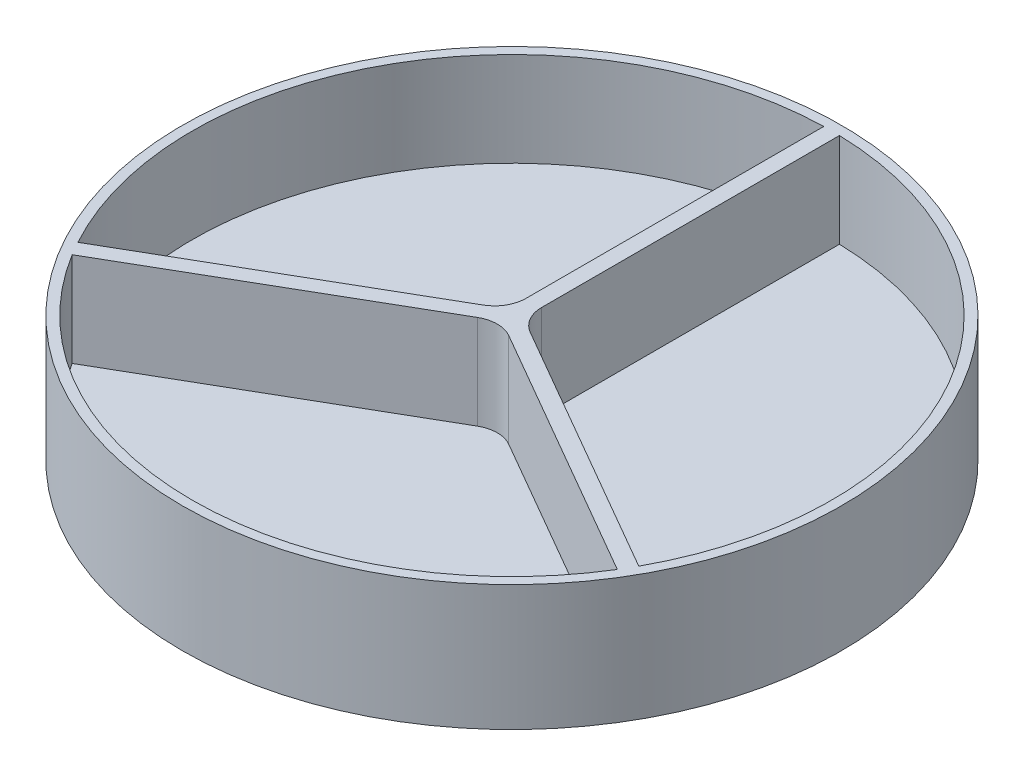
ISO-10303-21;
HEADER;
FILE_DESCRIPTION(('STEP AP214'),'2;1');
FILE_NAME('part.step','',(''),(''),'','','');
FILE_SCHEMA(('AUTOMOTIVE_DESIGN { 1 0 10303 214 1 1 1 1 }'));
ENDSEC;
DATA;
#1=APPLICATION_CONTEXT('core data for automotive mechanical design processes');
#2=APPLICATION_PROTOCOL_DEFINITION('international standard','automotive_design',2000,#1);
#3=PRODUCT_CONTEXT('',#1,'mechanical');
#4=PRODUCT('Part','Part','',(#3));
#5=PRODUCT_RELATED_PRODUCT_CATEGORY('part','',(#4));
#6=PRODUCT_DEFINITION_FORMATION('','',#4);
#7=PRODUCT_DEFINITION_CONTEXT('part definition',#1,'design');
#8=PRODUCT_DEFINITION('design','',#6,#7);
#9=PRODUCT_DEFINITION_SHAPE('','',#8);
#10=(LENGTH_UNIT() NAMED_UNIT(*) SI_UNIT(.MILLI.,.METRE.));
#11=(NAMED_UNIT(*) PLANE_ANGLE_UNIT() SI_UNIT($,.RADIAN.));
#12=(NAMED_UNIT(*) SI_UNIT($,.STERADIAN.) SOLID_ANGLE_UNIT());
#13=UNCERTAINTY_MEASURE_WITH_UNIT(LENGTH_MEASURE(1.E-05),#10,'distance_accuracy_value','');
#14=(GEOMETRIC_REPRESENTATION_CONTEXT(3) GLOBAL_UNCERTAINTY_ASSIGNED_CONTEXT((#13)) GLOBAL_UNIT_ASSIGNED_CONTEXT((#10,
#11,#12)) REPRESENTATION_CONTEXT('',''));
#15=CARTESIAN_POINT('',(0.,0.,0.));
#16=DIRECTION('',(0.,0.,1.));
#17=DIRECTION('',(1.,0.,0.));
#18=AXIS2_PLACEMENT_3D('',#15,#16,#17);
#19=CARTESIAN_POINT('',(0.,8.,0.));
#20=DIRECTION('',(0.,1.,0.));
#21=DIRECTION('',(0.,0.,1.));
#22=AXIS2_PLACEMENT_3D('',#19,#20,#21);
#23=PLANE('',#22);
#24=DIRECTION('',(0.866025403784439,0.,-0.5));
#25=VECTOR('',#24,1.);
#26=CARTESIAN_POINT('',(-0.916040457454182,8.,-1.58662861409928));
#27=LINE('',#26,#25);
#28=CARTESIAN_POINT('',(-71.4792752872217,8.,39.1530740097578));
#29=VERTEX_POINT('',#28);
#30=CARTESIAN_POINT('',(-6.,8.,1.34859679633871));
#31=VERTEX_POINT('',#30);
#32=EDGE_CURVE('E247',#29,#31,#27,.T.);
#33=ORIENTED_EDGE('',*,*,#32,.T.);
#34=CARTESIAN_POINT('',(-9.99999999999999,8.,-5.5796064339368));
#35=DIRECTION('',(0.,1.,0.));
#36=DIRECTION('',(0.,0.,1.));
#37=AXIS2_PLACEMENT_3D('',#34,#35,#36);
#38=CIRCLE('',#37,7.99999999999999);
#39=CARTESIAN_POINT('',(-2.,8.,-5.5796064339368));
#40=VERTEX_POINT('',#39);
#41=EDGE_CURVE('E270',#31,#40,#38,.T.);
#42=ORIENTED_EDGE('',*,*,#41,.T.);
#43=DIRECTION('',(0.,0.,1.));
#44=VECTOR('',#43,1.);
#45=CARTESIAN_POINT('',(-2.,8.,0.));
#46=LINE('',#45,#44);
#47=CARTESIAN_POINT('',(-2.,8.,-81.4754564270738));
#48=VERTEX_POINT('',#47);
#49=EDGE_CURVE('E91',#48,#40,#46,.T.);
#50=ORIENTED_EDGE('',*,*,#49,.F.);
#51=CARTESIAN_POINT('',(0.,8.,0.));
#52=DIRECTION('',(0.,1.,0.));
#53=DIRECTION('',(0.,0.,1.));
#54=AXIS2_PLACEMENT_3D('',#51,#52,#53);
#55=CIRCLE('',#54,81.5);
#56=EDGE_CURVE('E12',#48,#29,#55,.T.);
#57=ORIENTED_EDGE('',*,*,#56,.T.);
#58=EDGE_LOOP('',(#33,#42,#50,#57));
#59=FACE_BOUND('',#58,.T.);
#60=ADVANCED_FACE('F83',(#59),#23,.T.);
#61=CARTESIAN_POINT('',(1.08395954254582,32.,1.87747300103847));
#62=DIRECTION('',(-0.5,0.,-0.866025403784439));
#63=DIRECTION('',(-0.866025403784439,0.,0.5));
#64=AXIS2_PLACEMENT_3D('',#61,#62,#63);
#65=PLANE('',#64);
#66=DIRECTION('',(0.,-1.,0.));
#67=VECTOR('',#66,1.);
#68=CARTESIAN_POINT('',(-69.472135836453,32.,42.6130536610723));
#69=LINE('',#68,#67);
#70=CARTESIAN_POINT('',(-69.472135836453,32.,42.6130536610723));
#71=VERTEX_POINT('',#70);
#72=CARTESIAN_POINT('',(-69.472135836453,8.,42.6130536610723));
#73=VERTEX_POINT('',#72);
#74=EDGE_CURVE('E185',#71,#73,#69,.T.);
#75=ORIENTED_EDGE('',*,*,#74,.T.);
#76=DIRECTION('',(0.866025403784439,0.,-0.5));
#77=VECTOR('',#76,1.);
#78=CARTESIAN_POINT('',(1.08395954254582,8.,1.87747300103847));
#79=LINE('',#78,#77);
#80=CARTESIAN_POINT('',(-3.99999999999906,8.,4.81269841147592));
#81=VERTEX_POINT('',#80);
#82=EDGE_CURVE('E98',#73,#81,#79,.T.);
#83=ORIENTED_EDGE('',*,*,#82,.T.);
#84=DIRECTION('',(0.,-1.,0.));
#85=VECTOR('',#84,1.);
#86=CARTESIAN_POINT('',(-3.99999999999906,32.,4.81269841147592));
#87=LINE('',#86,#85);
#88=CARTESIAN_POINT('',(-3.99999999999906,32.,4.81269841147592));
#89=VERTEX_POINT('',#88);
#90=EDGE_CURVE('E245',#89,#81,#87,.T.);
#91=ORIENTED_EDGE('',*,*,#90,.F.);
#92=DIRECTION('',(0.866025403784439,0.,-0.5));
#93=VECTOR('',#92,1.);
#94=CARTESIAN_POINT('',(1.08395954254582,32.,1.87747300103847));
#95=LINE('',#94,#93);
#96=EDGE_CURVE('E229',#71,#89,#95,.T.);
#97=ORIENTED_EDGE('',*,*,#96,.F.);
#98=EDGE_LOOP('',(#75,#83,#91,#97));
#99=FACE_BOUND('',#98,.T.);
#100=ADVANCED_FACE('F316',(#99),#65,.F.);
#101=CARTESIAN_POINT('',(9.36750677027476E-13,32.,11.7409016417514));
#102=DIRECTION('',(0.,-1.,0.));
#103=DIRECTION('',(0.,0.,-1.));
#104=AXIS2_PLACEMENT_3D('',#101,#102,#103);
#105=CYLINDRICAL_SURFACE('',#104,7.99999999999999);
#106=ORIENTED_EDGE('',*,*,#90,.T.);
#107=CARTESIAN_POINT('',(9.36750677027476E-13,8.,11.7409016417514));
#108=DIRECTION('',(0.,1.,0.));
#109=DIRECTION('',(0.,0.,1.));
#110=AXIS2_PLACEMENT_3D('',#107,#108,#109);
#111=CIRCLE('',#110,7.99999999999999);
#112=CARTESIAN_POINT('',(4.00000000000093,8.,4.81269841147593));
#113=VERTEX_POINT('',#112);
#114=EDGE_CURVE('E105',#81,#113,#111,.F.);
#115=ORIENTED_EDGE('',*,*,#114,.T.);
#116=DIRECTION('',(0.,-1.,0.));
#117=VECTOR('',#116,1.);
#118=CARTESIAN_POINT('',(4.00000000000093,32.,4.81269841147593));
#119=LINE('',#118,#117);
#120=CARTESIAN_POINT('',(4.00000000000093,32.,4.81269841147593));
#121=VERTEX_POINT('',#120);
#122=EDGE_CURVE('E184',#121,#113,#119,.T.);
#123=ORIENTED_EDGE('',*,*,#122,.F.);
#124=CARTESIAN_POINT('',(9.36750677027476E-13,32.,11.7409016417514));
#125=DIRECTION('',(0.,1.,0.));
#126=DIRECTION('',(0.,0.,1.));
#127=AXIS2_PLACEMENT_3D('',#124,#125,#126);
#128=CIRCLE('',#127,7.99999999999999);
#129=EDGE_CURVE('E232',#89,#121,#128,.F.);
#130=ORIENTED_EDGE('',*,*,#129,.F.);
#131=EDGE_LOOP('',(#106,#115,#123,#130));
#132=FACE_BOUND('',#131,.T.);
#133=ADVANCED_FACE('F320',(#132),#105,.F.);
#134=CARTESIAN_POINT('',(-1.08395954254535,32.,1.87747300103767));
#135=DIRECTION('',(-0.5,0.,0.866025403784439));
#136=DIRECTION('',(0.866025403784439,0.,0.5));
#137=AXIS2_PLACEMENT_3D('',#134,#135,#136);
#138=PLANE('',#137);
#139=DIRECTION('',(-0.866025403784439,0.,-0.5));
#140=VECTOR('',#139,1.);
#141=CARTESIAN_POINT('',(-1.08395954254535,8.,1.87747300103767));
#142=LINE('',#141,#140);
#143=CARTESIAN_POINT('',(69.4721358364535,8.,42.6130536610715));
#144=VERTEX_POINT('',#143);
#145=EDGE_CURVE('E188',#144,#113,#142,.T.);
#146=ORIENTED_EDGE('',*,*,#145,.F.);
#147=DIRECTION('',(0.,-1.,0.));
#148=VECTOR('',#147,1.);
#149=CARTESIAN_POINT('',(69.4721358364535,32.,42.6130536610715));
#150=LINE('',#149,#148);
#151=CARTESIAN_POINT('',(69.4721358364535,32.,42.6130536610715));
#152=VERTEX_POINT('',#151);
#153=EDGE_CURVE('E174',#152,#144,#150,.T.);
#154=ORIENTED_EDGE('',*,*,#153,.F.);
#155=DIRECTION('',(-0.866025403784439,0.,-0.5));
#156=VECTOR('',#155,1.);
#157=CARTESIAN_POINT('',(-1.08395954254535,32.,1.87747300103767));
#158=LINE('',#157,#156);
#159=EDGE_CURVE('E234',#152,#121,#158,.T.);
#160=ORIENTED_EDGE('',*,*,#159,.T.);
#161=ORIENTED_EDGE('',*,*,#122,.T.);
#162=EDGE_LOOP('',(#146,#154,#160,#161));
#163=FACE_BOUND('',#162,.T.);
#164=ADVANCED_FACE('F189',(#163),#138,.T.);
#165=CARTESIAN_POINT('',(0.,32.,0.));
#166=DIRECTION('',(0.,-1.,0.));
#167=DIRECTION('',(0.,0.,-1.));
#168=AXIS2_PLACEMENT_3D('',#165,#166,#167);
#169=CYLINDRICAL_SURFACE('',#168,81.5);
#170=DIRECTION('',(0.,-1.,0.));
#171=VECTOR('',#170,1.);
#172=CARTESIAN_POINT('',(-71.4792752872217,32.,39.1530740097578));
#173=LINE('',#172,#171);
#174=CARTESIAN_POINT('',(-71.4792752872217,32.,39.1530740097578));
#175=VERTEX_POINT('',#174);
#176=EDGE_CURVE('E248',#175,#29,#173,.T.);
#177=ORIENTED_EDGE('',*,*,#176,.T.);
#178=ORIENTED_EDGE('',*,*,#56,.F.);
#179=DIRECTION('',(0.,-1.,0.));
#180=VECTOR('',#179,1.);
#181=CARTESIAN_POINT('',(-2.,32.,-81.4754564270738));
#182=LINE('',#181,#180);
#183=CARTESIAN_POINT('',(-2.,32.,-81.4754564270738));
#184=VERTEX_POINT('',#183);
#185=EDGE_CURVE('E242',#184,#48,#182,.T.);
#186=ORIENTED_EDGE('',*,*,#185,.F.);
#187=CARTESIAN_POINT('',(0.,32.,0.));
#188=DIRECTION('',(0.,1.,0.));
#189=DIRECTION('',(0.,0.,1.));
#190=AXIS2_PLACEMENT_3D('',#187,#188,#189);
#191=CIRCLE('',#190,81.5);
#192=EDGE_CURVE('E213',#184,#175,#191,.T.);
#193=ORIENTED_EDGE('',*,*,#192,.T.);
#194=EDGE_LOOP('',(#177,#178,#186,#193));
#195=FACE_BOUND('',#194,.T.);
#196=ADVANCED_FACE('F286',(#195),#169,.F.);
#197=CARTESIAN_POINT('',(-2.,32.,0.));
#198=DIRECTION('',(1.,0.,0.));
#199=DIRECTION('',(0.,0.,-1.));
#200=AXIS2_PLACEMENT_3D('',#197,#198,#199);
#201=PLANE('',#200);
#202=ORIENTED_EDGE('',*,*,#49,.T.);
#203=DIRECTION('',(0.,-1.,0.));
#204=VECTOR('',#203,1.);
#205=CARTESIAN_POINT('',(-2.,32.,-5.5796064339368));
#206=LINE('',#205,#204);
#207=CARTESIAN_POINT('',(-2.,32.,-5.5796064339368));
#208=VERTEX_POINT('',#207);
#209=EDGE_CURVE('E254',#208,#40,#206,.T.);
#210=ORIENTED_EDGE('',*,*,#209,.F.);
#211=DIRECTION('',(0.,0.,1.));
#212=VECTOR('',#211,1.);
#213=CARTESIAN_POINT('',(-2.,32.,0.));
#214=LINE('',#213,#212);
#215=EDGE_CURVE('E221',#184,#208,#214,.T.);
#216=ORIENTED_EDGE('',*,*,#215,.F.);
#217=ORIENTED_EDGE('',*,*,#185,.T.);
#218=EDGE_LOOP('',(#202,#210,#216,#217));
#219=FACE_BOUND('',#218,.T.);
#220=ADVANCED_FACE('F275',(#219),#201,.F.);
#221=CARTESIAN_POINT('',(-9.99999999999999,32.,-5.5796064339368));
#222=DIRECTION('',(0.,-1.,0.));
#223=DIRECTION('',(0.,0.,-1.));
#224=AXIS2_PLACEMENT_3D('',#221,#222,#223);
#225=CYLINDRICAL_SURFACE('',#224,7.99999999999999);
#226=ORIENTED_EDGE('',*,*,#209,.T.);
#227=ORIENTED_EDGE('',*,*,#41,.F.);
#228=DIRECTION('',(0.,-1.,0.));
#229=VECTOR('',#228,1.);
#230=CARTESIAN_POINT('',(-6.,32.,1.34859679633871));
#231=LINE('',#230,#229);
#232=CARTESIAN_POINT('',(-6.,32.,1.34859679633871));
#233=VERTEX_POINT('',#232);
#234=EDGE_CURVE('E251',#233,#31,#231,.T.);
#235=ORIENTED_EDGE('',*,*,#234,.F.);
#236=CARTESIAN_POINT('',(-9.99999999999999,32.,-5.5796064339368));
#237=DIRECTION('',(0.,1.,0.));
#238=DIRECTION('',(0.,0.,1.));
#239=AXIS2_PLACEMENT_3D('',#236,#237,#238);
#240=CIRCLE('',#239,7.99999999999999);
#241=EDGE_CURVE('E223',#233,#208,#240,.T.);
#242=ORIENTED_EDGE('',*,*,#241,.T.);
#243=EDGE_LOOP('',(#226,#227,#235,#242));
#244=FACE_BOUND('',#243,.T.);
#245=ADVANCED_FACE('F280',(#244),#225,.F.);
#246=CARTESIAN_POINT('',(0.,8.,0.));
#247=DIRECTION('',(0.,1.,0.));
#248=DIRECTION('',(0.,0.,1.));
#249=AXIS2_PLACEMENT_3D('',#246,#247,#248);
#250=CIRCLE('',#249,81.5);
#251=CARTESIAN_POINT('',(71.4792752872222,8.,39.153074009757));
#252=VERTEX_POINT('',#251);
#253=CARTESIAN_POINT('',(2.,8.,-81.4754564270738));
#254=VERTEX_POINT('',#253);
#255=EDGE_CURVE('E205',#252,#254,#250,.T.);
#256=ORIENTED_EDGE('',*,*,#255,.F.);
#257=DIRECTION('',(0.,-1.,0.));
#258=VECTOR('',#257,1.);
#259=CARTESIAN_POINT('',(71.4792752872222,32.,39.153074009757));
#260=LINE('',#259,#258);
#261=CARTESIAN_POINT('',(71.4792752872222,32.,39.153074009757));
#262=VERTEX_POINT('',#261);
#263=EDGE_CURVE('E252',#262,#252,#260,.T.);
#264=ORIENTED_EDGE('',*,*,#263,.F.);
#265=CARTESIAN_POINT('',(2.,32.,-81.4754564270738));
#266=VERTEX_POINT('',#265);
#267=EDGE_CURVE('E209',#262,#266,#191,.T.);
#268=ORIENTED_EDGE('',*,*,#267,.T.);
#269=DIRECTION('',(0.,-1.,0.));
#270=VECTOR('',#269,1.);
#271=CARTESIAN_POINT('',(2.,32.,-81.4754564270738));
#272=LINE('',#271,#270);
#273=EDGE_CURVE('E239',#266,#254,#272,.T.);
#274=ORIENTED_EDGE('',*,*,#273,.T.);
#275=EDGE_LOOP('',(#256,#264,#268,#274));
#276=FACE_BOUND('',#275,.T.);
#277=ADVANCED_FACE('F327',(#276),#169,.F.);
#278=CARTESIAN_POINT('',(0.916040457454646,32.,-1.58662861410009));
#279=DIRECTION('',(-0.5,0.,0.866025403784439));
#280=DIRECTION('',(0.866025403784439,0.,0.5));
#281=AXIS2_PLACEMENT_3D('',#278,#279,#280);
#282=PLANE('',#281);
#283=ORIENTED_EDGE('',*,*,#263,.T.);
#284=DIRECTION('',(-0.866025403784439,0.,-0.5));
#285=VECTOR('',#284,1.);
#286=CARTESIAN_POINT('',(0.916040457454646,8.,-1.58662861410009));
#287=LINE('',#286,#285);
#288=CARTESIAN_POINT('',(5.99999999999999,8.,1.34859679633764));
#289=VERTEX_POINT('',#288);
#290=EDGE_CURVE('E203',#252,#289,#287,.T.);
#291=ORIENTED_EDGE('',*,*,#290,.T.);
#292=DIRECTION('',(0.,-1.,0.));
#293=VECTOR('',#292,1.);
#294=CARTESIAN_POINT('',(5.99999999999999,32.,1.34859679633764));
#295=LINE('',#294,#293);
#296=CARTESIAN_POINT('',(5.99999999999999,32.,1.34859679633764));
#297=VERTEX_POINT('',#296);
#298=EDGE_CURVE('E263',#297,#289,#295,.T.);
#299=ORIENTED_EDGE('',*,*,#298,.F.);
#300=DIRECTION('',(-0.866025403784439,0.,-0.5));
#301=VECTOR('',#300,1.);
#302=CARTESIAN_POINT('',(0.916040457454646,32.,-1.58662861410009));
#303=LINE('',#302,#301);
#304=EDGE_CURVE('E212',#262,#297,#303,.T.);
#305=ORIENTED_EDGE('',*,*,#304,.F.);
#306=EDGE_LOOP('',(#283,#291,#299,#305));
#307=FACE_BOUND('',#306,.T.);
#308=ADVANCED_FACE('F323',(#307),#282,.F.);
#309=CARTESIAN_POINT('',(9.99999999999999,32.,-5.57960643393789));
#310=DIRECTION('',(0.,-1.,0.));
#311=DIRECTION('',(0.,0.,-1.));
#312=AXIS2_PLACEMENT_3D('',#309,#310,#311);
#313=CYLINDRICAL_SURFACE('',#312,8.);
#314=CARTESIAN_POINT('',(9.99999999999999,8.,-5.57960643393789));
#315=DIRECTION('',(0.,1.,0.));
#316=DIRECTION('',(0.,0.,1.));
#317=AXIS2_PLACEMENT_3D('',#314,#315,#316);
#318=CIRCLE('',#317,8.);
#319=CARTESIAN_POINT('',(2.,8.,-5.57960643393789));
#320=VERTEX_POINT('',#319);
#321=EDGE_CURVE('E200',#320,#289,#318,.T.);
#322=ORIENTED_EDGE('',*,*,#321,.F.);
#323=DIRECTION('',(0.,-1.,0.));
#324=VECTOR('',#323,1.);
#325=CARTESIAN_POINT('',(2.,32.,-5.57960643393789));
#326=LINE('',#325,#324);
#327=CARTESIAN_POINT('',(2.,32.,-5.57960643393789));
#328=VERTEX_POINT('',#327);
#329=EDGE_CURVE('E261',#328,#320,#326,.T.);
#330=ORIENTED_EDGE('',*,*,#329,.F.);
#331=CARTESIAN_POINT('',(9.99999999999999,32.,-5.57960643393789));
#332=DIRECTION('',(0.,1.,0.));
#333=DIRECTION('',(0.,0.,1.));
#334=AXIS2_PLACEMENT_3D('',#331,#332,#333);
#335=CIRCLE('',#334,8.);
#336=EDGE_CURVE('E215',#328,#297,#335,.T.);
#337=ORIENTED_EDGE('',*,*,#336,.T.);
#338=ORIENTED_EDGE('',*,*,#298,.T.);
#339=EDGE_LOOP('',(#322,#330,#337,#338));
#340=FACE_BOUND('',#339,.T.);
#341=ADVANCED_FACE('F326',(#340),#313,.F.);
#342=CARTESIAN_POINT('',(0.,8.,0.));
#343=DIRECTION('',(0.,1.,0.));
#344=DIRECTION('',(0.,0.,1.));
#345=AXIS2_PLACEMENT_3D('',#342,#343,#344);
#346=CIRCLE('',#345,81.5);
#347=EDGE_CURVE('E178',#73,#144,#346,.T.);
#348=ORIENTED_EDGE('',*,*,#347,.F.);
#349=ORIENTED_EDGE('',*,*,#74,.F.);
#350=EDGE_CURVE('E180',#71,#152,#191,.T.);
#351=ORIENTED_EDGE('',*,*,#350,.T.);
#352=ORIENTED_EDGE('',*,*,#153,.T.);
#353=EDGE_LOOP('',(#348,#349,#351,#352));
#354=FACE_BOUND('',#353,.T.);
#355=ADVANCED_FACE('F176',(#354),#169,.F.);
#356=CARTESIAN_POINT('',(-0.916040457454182,32.,-1.58662861409928));
#357=DIRECTION('',(-0.5,0.,-0.866025403784439));
#358=DIRECTION('',(-0.866025403784439,0.,0.5));
#359=AXIS2_PLACEMENT_3D('',#356,#357,#358);
#360=PLANE('',#359);
#361=ORIENTED_EDGE('',*,*,#234,.T.);
#362=ORIENTED_EDGE('',*,*,#32,.F.);
#363=ORIENTED_EDGE('',*,*,#176,.F.);
#364=DIRECTION('',(0.866025403784439,0.,-0.5));
#365=VECTOR('',#364,1.);
#366=CARTESIAN_POINT('',(-0.916040457454182,32.,-1.58662861409928));
#367=LINE('',#366,#365);
#368=EDGE_CURVE('E226',#175,#233,#367,.T.);
#369=ORIENTED_EDGE('',*,*,#368,.T.);
#370=EDGE_LOOP('',(#361,#362,#363,#369));
#371=FACE_BOUND('',#370,.T.);
#372=ADVANCED_FACE('F283',(#371),#360,.T.);
#373=CARTESIAN_POINT('',(2.,32.,0.));
#374=DIRECTION('',(1.,0.,0.));
#375=DIRECTION('',(0.,0.,-1.));
#376=AXIS2_PLACEMENT_3D('',#373,#374,#375);
#377=PLANE('',#376);
#378=DIRECTION('',(0.,0.,1.));
#379=VECTOR('',#378,1.);
#380=CARTESIAN_POINT('',(2.,8.,0.));
#381=LINE('',#380,#379);
#382=EDGE_CURVE('E191',#254,#320,#381,.T.);
#383=ORIENTED_EDGE('',*,*,#382,.F.);
#384=ORIENTED_EDGE('',*,*,#273,.F.);
#385=DIRECTION('',(0.,0.,1.));
#386=VECTOR('',#385,1.);
#387=CARTESIAN_POINT('',(2.,32.,0.));
#388=LINE('',#387,#386);
#389=EDGE_CURVE('E218',#266,#328,#388,.T.);
#390=ORIENTED_EDGE('',*,*,#389,.T.);
#391=ORIENTED_EDGE('',*,*,#329,.T.);
#392=EDGE_LOOP('',(#383,#384,#390,#391));
#393=FACE_BOUND('',#392,.T.);
#394=ADVANCED_FACE('F302',(#393),#377,.T.);
#395=CARTESIAN_POINT('',(0.,32.,0.));
#396=DIRECTION('',(0.,-1.,0.));
#397=DIRECTION('',(0.,0.,-1.));
#398=AXIS2_PLACEMENT_3D('',#395,#396,#397);
#399=CYLINDRICAL_SURFACE('',#398,84.);
#400=CARTESIAN_POINT('',(0.,32.,0.));
#401=DIRECTION('',(0.,1.,0.));
#402=DIRECTION('',(0.,0.,1.));
#403=AXIS2_PLACEMENT_3D('',#400,#401,#402);
#404=CIRCLE('',#403,84.);
#405=CARTESIAN_POINT('',(0.,32.,84.));
#406=VERTEX_POINT('',#405);
#407=EDGE_CURVE('E236',#406,#406,#404,.T.);
#408=ORIENTED_EDGE('',*,*,#407,.F.);
#409=EDGE_LOOP('',(#408));
#410=FACE_BOUND('',#409,.T.);
#411=CARTESIAN_POINT('',(0.,0.,0.));
#412=DIRECTION('',(0.,1.,0.));
#413=DIRECTION('',(0.,0.,1.));
#414=AXIS2_PLACEMENT_3D('',#411,#412,#413);
#415=CIRCLE('',#414,84.);
#416=CARTESIAN_POINT('',(0.,0.,84.));
#417=VERTEX_POINT('',#416);
#418=EDGE_CURVE('E208',#417,#417,#415,.T.);
#419=ORIENTED_EDGE('',*,*,#418,.T.);
#420=EDGE_LOOP('',(#419));
#421=FACE_BOUND('',#420,.T.);
#422=ADVANCED_FACE('F293',(#410,#421),#399,.T.);
#423=CARTESIAN_POINT('',(0.,32.,0.));
#424=DIRECTION('',(0.,1.,0.));
#425=DIRECTION('',(0.,0.,1.));
#426=AXIS2_PLACEMENT_3D('',#423,#424,#425);
#427=PLANE('',#426);
#428=ORIENTED_EDGE('',*,*,#267,.F.);
#429=ORIENTED_EDGE('',*,*,#304,.T.);
#430=ORIENTED_EDGE('',*,*,#336,.F.);
#431=ORIENTED_EDGE('',*,*,#389,.F.);
#432=EDGE_LOOP('',(#428,#429,#430,#431));
#433=FACE_BOUND('',#432,.T.);
#434=ORIENTED_EDGE('',*,*,#192,.F.);
#435=ORIENTED_EDGE('',*,*,#215,.T.);
#436=ORIENTED_EDGE('',*,*,#241,.F.);
#437=ORIENTED_EDGE('',*,*,#368,.F.);
#438=EDGE_LOOP('',(#434,#435,#436,#437));
#439=FACE_BOUND('',#438,.T.);
#440=ORIENTED_EDGE('',*,*,#96,.T.);
#441=ORIENTED_EDGE('',*,*,#129,.T.);
#442=ORIENTED_EDGE('',*,*,#159,.F.);
#443=ORIENTED_EDGE('',*,*,#350,.F.);
#444=EDGE_LOOP('',(#440,#441,#442,#443));
#445=FACE_BOUND('',#444,.T.);
#446=ORIENTED_EDGE('',*,*,#407,.T.);
#447=EDGE_LOOP('',(#446));
#448=FACE_BOUND('',#447,.T.);
#449=ADVANCED_FACE('F290',(#433,#439,#445,#448),#427,.T.);
#450=CARTESIAN_POINT('',(0.,0.,0.));
#451=DIRECTION('',(0.,1.,0.));
#452=DIRECTION('',(0.,0.,1.));
#453=AXIS2_PLACEMENT_3D('',#450,#451,#452);
#454=PLANE('',#453);
#455=CARTESIAN_POINT('',(0.,0.,0.));
#456=DIRECTION('',(0.,1.,0.));
#457=DIRECTION('',(0.,0.,1.));
#458=AXIS2_PLACEMENT_3D('',#455,#456,#457);
#459=CIRCLE('',#458,2.95);
#460=CARTESIAN_POINT('',(0.,0.,2.95));
#461=VERTEX_POINT('',#460);
#462=EDGE_CURVE('E361',#461,#461,#459,.T.);
#463=ORIENTED_EDGE('',*,*,#462,.T.);
#464=EDGE_LOOP('',(#463));
#465=FACE_BOUND('',#464,.T.);
#466=ORIENTED_EDGE('',*,*,#418,.F.);
#467=EDGE_LOOP('',(#466));
#468=FACE_BOUND('',#467,.T.);
#469=ADVANCED_FACE('F85',(#465,#468),#454,.F.);
#470=CARTESIAN_POINT('',(0.,8.,0.));
#471=DIRECTION('',(0.,1.,0.));
#472=DIRECTION('',(0.,0.,1.));
#473=AXIS2_PLACEMENT_3D('',#470,#471,#472);
#474=PLANE('',#473);
#475=ORIENTED_EDGE('',*,*,#382,.T.);
#476=ORIENTED_EDGE('',*,*,#321,.T.);
#477=ORIENTED_EDGE('',*,*,#290,.F.);
#478=ORIENTED_EDGE('',*,*,#255,.T.);
#479=EDGE_LOOP('',(#475,#476,#477,#478));
#480=FACE_BOUND('',#479,.T.);
#481=ADVANCED_FACE('F307',(#480),#474,.T.);
#482=CARTESIAN_POINT('',(0.,8.,0.));
#483=DIRECTION('',(0.,1.,0.));
#484=DIRECTION('',(0.,0.,1.));
#485=AXIS2_PLACEMENT_3D('',#482,#483,#484);
#486=PLANE('',#485);
#487=ORIENTED_EDGE('',*,*,#114,.F.);
#488=ORIENTED_EDGE('',*,*,#82,.F.);
#489=ORIENTED_EDGE('',*,*,#347,.T.);
#490=ORIENTED_EDGE('',*,*,#145,.T.);
#491=EDGE_LOOP('',(#487,#488,#489,#490));
#492=FACE_BOUND('',#491,.T.);
#493=ADVANCED_FACE('F193',(#492),#486,.T.);
#494=CARTESIAN_POINT('',(0.,8.,0.));
#495=DIRECTION('',(0.,-1.,0.));
#496=DIRECTION('',(0.,0.,-1.));
#497=AXIS2_PLACEMENT_3D('',#494,#495,#496);
#498=CYLINDRICAL_SURFACE('',#497,2.95);
#499=CARTESIAN_POINT('',(0.,8.,0.));
#500=DIRECTION('',(0.,1.,0.));
#501=DIRECTION('',(0.,0.,1.));
#502=AXIS2_PLACEMENT_3D('',#499,#500,#501);
#503=CIRCLE('',#502,2.95);
#504=CARTESIAN_POINT('',(0.,8.,2.95));
#505=VERTEX_POINT('',#504);
#506=EDGE_CURVE('E360',#505,#505,#503,.T.);
#507=ORIENTED_EDGE('',*,*,#506,.T.);
#508=EDGE_LOOP('',(#507));
#509=FACE_BOUND('',#508,.T.);
#510=ORIENTED_EDGE('',*,*,#462,.F.);
#511=EDGE_LOOP('',(#510));
#512=FACE_BOUND('',#511,.T.);
#513=ADVANCED_FACE('F349',(#509,#512),#498,.F.);
#514=CARTESIAN_POINT('',(0.,8.,0.));
#515=DIRECTION('',(0.,1.,0.));
#516=DIRECTION('',(0.,0.,1.));
#517=AXIS2_PLACEMENT_3D('',#514,#515,#516);
#518=PLANE('',#517);
#519=ORIENTED_EDGE('',*,*,#506,.F.);
#520=EDGE_LOOP('',(#519));
#521=FACE_BOUND('',#520,.T.);
#522=ADVANCED_FACE('F352',(#521),#518,.F.);
#523=CLOSED_SHELL('',(#60,#100,#133,#164,#196,#220,#245,#277,#308,#341,#355,#372,#394,#422,#449,
#469,#481,#493,#513,#522));
#524=MANIFOLD_SOLID_BREP('B2',#523);
#525=ADVANCED_BREP_SHAPE_REPRESENTATION('',(#18,#524),#14);
#526=SHAPE_DEFINITION_REPRESENTATION(#9,#525);
ENDSEC;
END-ISO-10303-21;
